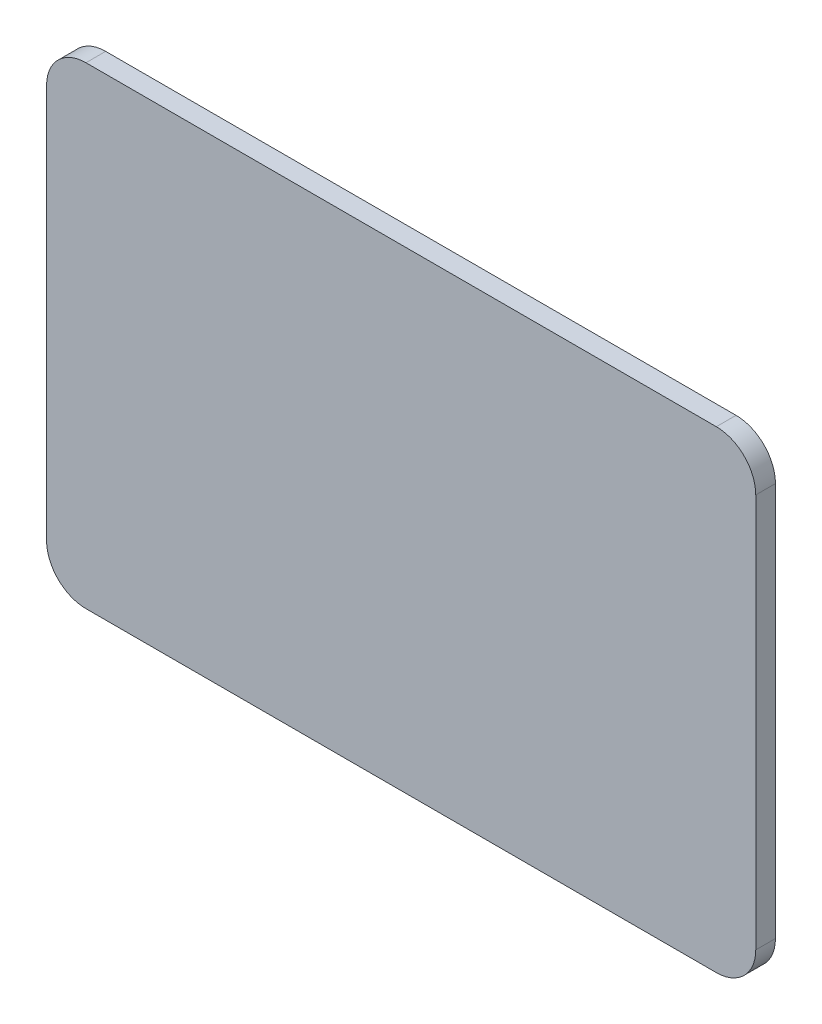
ISO-10303-21;
HEADER;
FILE_DESCRIPTION(('STEP AP214'),'2;1');
FILE_NAME('part.step','',(''),(''),'','','');
FILE_SCHEMA(('AUTOMOTIVE_DESIGN { 1 0 10303 214 1 1 1 1 }'));
ENDSEC;
DATA;
#1=APPLICATION_CONTEXT('core data for automotive mechanical design processes');
#2=APPLICATION_PROTOCOL_DEFINITION('international standard','automotive_design',2000,#1);
#3=PRODUCT_CONTEXT('',#1,'mechanical');
#4=PRODUCT('Part','Part','',(#3));
#5=PRODUCT_RELATED_PRODUCT_CATEGORY('part','',(#4));
#6=PRODUCT_DEFINITION_FORMATION('','',#4);
#7=PRODUCT_DEFINITION_CONTEXT('part definition',#1,'design');
#8=PRODUCT_DEFINITION('design','',#6,#7);
#9=PRODUCT_DEFINITION_SHAPE('','',#8);
#10=(LENGTH_UNIT() NAMED_UNIT(*) SI_UNIT(.MILLI.,.METRE.));
#11=(NAMED_UNIT(*) PLANE_ANGLE_UNIT() SI_UNIT($,.RADIAN.));
#12=(NAMED_UNIT(*) SI_UNIT($,.STERADIAN.) SOLID_ANGLE_UNIT());
#13=UNCERTAINTY_MEASURE_WITH_UNIT(LENGTH_MEASURE(1.E-05),#10,'distance_accuracy_value','');
#14=(GEOMETRIC_REPRESENTATION_CONTEXT(3) GLOBAL_UNCERTAINTY_ASSIGNED_CONTEXT((#13)) GLOBAL_UNIT_ASSIGNED_CONTEXT((#10,
#11,#12)) REPRESENTATION_CONTEXT('',''));
#15=CARTESIAN_POINT('',(0.,0.,0.));
#16=DIRECTION('',(0.,0.,1.));
#17=DIRECTION('',(1.,0.,0.));
#18=AXIS2_PLACEMENT_3D('',#15,#16,#17);
#19=CARTESIAN_POINT('',(57.15,38.1,3.175));
#20=DIRECTION('',(-1.,0.,0.));
#21=DIRECTION('',(0.,-1.,0.));
#22=AXIS2_PLACEMENT_3D('',#19,#20,#21);
#23=PLANE('',#22);
#24=DIRECTION('',(0.,1.,0.));
#25=VECTOR('',#24,1.);
#26=CARTESIAN_POINT('',(57.15,38.1,3.175));
#27=LINE('',#26,#25);
#28=CARTESIAN_POINT('',(57.15,-31.75,3.175));
#29=VERTEX_POINT('',#28);
#30=CARTESIAN_POINT('',(57.15,31.75,3.175));
#31=VERTEX_POINT('',#30);
#32=EDGE_CURVE('E124',#29,#31,#27,.T.);
#33=ORIENTED_EDGE('',*,*,#32,.F.);
#34=DIRECTION('',(0.,0.,-1.));
#35=VECTOR('',#34,1.);
#36=CARTESIAN_POINT('',(57.15,-31.75,3.175));
#37=LINE('',#36,#35);
#38=CARTESIAN_POINT('',(57.15,-31.75,0.));
#39=VERTEX_POINT('',#38);
#40=EDGE_CURVE('E109',#29,#39,#37,.T.);
#41=ORIENTED_EDGE('',*,*,#40,.T.);
#42=DIRECTION('',(0.,1.,0.));
#43=VECTOR('',#42,1.);
#44=CARTESIAN_POINT('',(57.15,38.1,0.));
#45=LINE('',#44,#43);
#46=CARTESIAN_POINT('',(57.15,31.75,0.));
#47=VERTEX_POINT('',#46);
#48=EDGE_CURVE('E121',#39,#47,#45,.T.);
#49=ORIENTED_EDGE('',*,*,#48,.T.);
#50=DIRECTION('',(0.,0.,-1.));
#51=VECTOR('',#50,1.);
#52=CARTESIAN_POINT('',(57.15,31.75,3.175));
#53=LINE('',#52,#51);
#54=EDGE_CURVE('E126',#47,#31,#53,.F.);
#55=ORIENTED_EDGE('',*,*,#54,.T.);
#56=EDGE_LOOP('',(#33,#41,#49,#55));
#57=FACE_BOUND('',#56,.T.);
#58=ADVANCED_FACE('F39',(#57),#23,.F.);
#59=CARTESIAN_POINT('',(-57.15,38.1,3.175));
#60=DIRECTION('',(0.,-1.,0.));
#61=DIRECTION('',(0.,0.,-1.));
#62=AXIS2_PLACEMENT_3D('',#59,#60,#61);
#63=PLANE('',#62);
#64=DIRECTION('',(-1.,0.,0.));
#65=VECTOR('',#64,1.);
#66=CARTESIAN_POINT('',(-57.15,38.1,3.175));
#67=LINE('',#66,#65);
#68=CARTESIAN_POINT('',(50.8,38.1,3.175));
#69=VERTEX_POINT('',#68);
#70=CARTESIAN_POINT('',(-50.8,38.1,3.175));
#71=VERTEX_POINT('',#70);
#72=EDGE_CURVE('E164',#69,#71,#67,.T.);
#73=ORIENTED_EDGE('',*,*,#72,.F.);
#74=DIRECTION('',(0.,0.,-1.));
#75=VECTOR('',#74,1.);
#76=CARTESIAN_POINT('',(50.8,38.1,3.175));
#77=LINE('',#76,#75);
#78=CARTESIAN_POINT('',(50.8,38.1,0.));
#79=VERTEX_POINT('',#78);
#80=EDGE_CURVE('E176',#69,#79,#77,.T.);
#81=ORIENTED_EDGE('',*,*,#80,.T.);
#82=DIRECTION('',(-1.,0.,0.));
#83=VECTOR('',#82,1.);
#84=CARTESIAN_POINT('',(-57.15,38.1,0.));
#85=LINE('',#84,#83);
#86=CARTESIAN_POINT('',(-50.8,38.1,0.));
#87=VERTEX_POINT('',#86);
#88=EDGE_CURVE('E130',#79,#87,#85,.T.);
#89=ORIENTED_EDGE('',*,*,#88,.T.);
#90=DIRECTION('',(0.,0.,-1.));
#91=VECTOR('',#90,1.);
#92=CARTESIAN_POINT('',(-50.8,38.1,3.175));
#93=LINE('',#92,#91);
#94=EDGE_CURVE('E174',#87,#71,#93,.F.);
#95=ORIENTED_EDGE('',*,*,#94,.T.);
#96=EDGE_LOOP('',(#73,#81,#89,#95));
#97=FACE_BOUND('',#96,.T.);
#98=ADVANCED_FACE('F181',(#97),#63,.F.);
#99=CARTESIAN_POINT('',(-57.15,38.1,3.175));
#100=DIRECTION('',(1.,0.,0.));
#101=DIRECTION('',(0.,1.,0.));
#102=AXIS2_PLACEMENT_3D('',#99,#100,#101);
#103=PLANE('',#102);
#104=DIRECTION('',(0.,-1.,0.));
#105=VECTOR('',#104,1.);
#106=CARTESIAN_POINT('',(-57.15,38.1,3.175));
#107=LINE('',#106,#105);
#108=CARTESIAN_POINT('',(-57.15,31.75,3.175));
#109=VERTEX_POINT('',#108);
#110=CARTESIAN_POINT('',(-57.15,-31.75,3.175));
#111=VERTEX_POINT('',#110);
#112=EDGE_CURVE('E162',#109,#111,#107,.T.);
#113=ORIENTED_EDGE('',*,*,#112,.F.);
#114=DIRECTION('',(0.,0.,-1.));
#115=VECTOR('',#114,1.);
#116=CARTESIAN_POINT('',(-57.15,31.75,3.175));
#117=LINE('',#116,#115);
#118=CARTESIAN_POINT('',(-57.15,31.75,0.));
#119=VERTEX_POINT('',#118);
#120=EDGE_CURVE('E12',#109,#119,#117,.T.);
#121=ORIENTED_EDGE('',*,*,#120,.T.);
#122=DIRECTION('',(0.,-1.,0.));
#123=VECTOR('',#122,1.);
#124=CARTESIAN_POINT('',(-57.15,38.1,0.));
#125=LINE('',#124,#123);
#126=CARTESIAN_POINT('',(-57.15,-31.75,0.));
#127=VERTEX_POINT('',#126);
#128=EDGE_CURVE('E133',#119,#127,#125,.T.);
#129=ORIENTED_EDGE('',*,*,#128,.T.);
#130=DIRECTION('',(0.,0.,-1.));
#131=VECTOR('',#130,1.);
#132=CARTESIAN_POINT('',(-57.15,-31.75,3.175));
#133=LINE('',#132,#131);
#134=EDGE_CURVE('E47',#127,#111,#133,.F.);
#135=ORIENTED_EDGE('',*,*,#134,.T.);
#136=EDGE_LOOP('',(#113,#121,#129,#135));
#137=FACE_BOUND('',#136,.T.);
#138=ADVANCED_FACE('F189',(#137),#103,.F.);
#139=CARTESIAN_POINT('',(-57.15,-38.1,3.175));
#140=DIRECTION('',(0.,1.,0.));
#141=DIRECTION('',(0.,0.,1.));
#142=AXIS2_PLACEMENT_3D('',#139,#140,#141);
#143=PLANE('',#142);
#144=DIRECTION('',(1.,0.,0.));
#145=VECTOR('',#144,1.);
#146=CARTESIAN_POINT('',(-57.15,-38.1,0.));
#147=LINE('',#146,#145);
#148=CARTESIAN_POINT('',(-50.8,-38.1,0.));
#149=VERTEX_POINT('',#148);
#150=CARTESIAN_POINT('',(50.8,-38.1,0.));
#151=VERTEX_POINT('',#150);
#152=EDGE_CURVE('E141',#149,#151,#147,.T.);
#153=ORIENTED_EDGE('',*,*,#152,.T.);
#154=DIRECTION('',(0.,0.,-1.));
#155=VECTOR('',#154,1.);
#156=CARTESIAN_POINT('',(50.8,-38.1,3.175));
#157=LINE('',#156,#155);
#158=CARTESIAN_POINT('',(50.8,-38.1,3.175));
#159=VERTEX_POINT('',#158);
#160=EDGE_CURVE('E110',#151,#159,#157,.F.);
#161=ORIENTED_EDGE('',*,*,#160,.T.);
#162=DIRECTION('',(1.,0.,0.));
#163=VECTOR('',#162,1.);
#164=CARTESIAN_POINT('',(-57.15,-38.1,3.175));
#165=LINE('',#164,#163);
#166=CARTESIAN_POINT('',(-50.8,-38.1,3.175));
#167=VERTEX_POINT('',#166);
#168=EDGE_CURVE('E136',#167,#159,#165,.T.);
#169=ORIENTED_EDGE('',*,*,#168,.F.);
#170=DIRECTION('',(0.,0.,-1.));
#171=VECTOR('',#170,1.);
#172=CARTESIAN_POINT('',(-50.8,-38.1,3.175));
#173=LINE('',#172,#171);
#174=EDGE_CURVE('E115',#167,#149,#173,.T.);
#175=ORIENTED_EDGE('',*,*,#174,.T.);
#176=EDGE_LOOP('',(#153,#161,#169,#175));
#177=FACE_BOUND('',#176,.T.);
#178=ADVANCED_FACE('F197',(#177),#143,.F.);
#179=CARTESIAN_POINT('',(0.,0.,3.175));
#180=DIRECTION('',(0.,0.,1.));
#181=DIRECTION('',(1.,0.,0.));
#182=AXIS2_PLACEMENT_3D('',#179,#180,#181);
#183=PLANE('',#182);
#184=ORIENTED_EDGE('',*,*,#168,.T.);
#185=CARTESIAN_POINT('',(50.8,-31.75,3.175));
#186=DIRECTION('',(0.,0.,1.));
#187=DIRECTION('',(1.,0.,0.));
#188=AXIS2_PLACEMENT_3D('',#185,#186,#187);
#189=CIRCLE('',#188,6.35);
#190=EDGE_CURVE('E171',#159,#29,#189,.T.);
#191=ORIENTED_EDGE('',*,*,#190,.T.);
#192=ORIENTED_EDGE('',*,*,#32,.T.);
#193=CARTESIAN_POINT('',(50.8,31.75,3.175));
#194=DIRECTION('',(0.,0.,1.));
#195=DIRECTION('',(1.,0.,0.));
#196=AXIS2_PLACEMENT_3D('',#193,#194,#195);
#197=CIRCLE('',#196,6.35);
#198=EDGE_CURVE('E155',#31,#69,#197,.T.);
#199=ORIENTED_EDGE('',*,*,#198,.T.);
#200=ORIENTED_EDGE('',*,*,#72,.T.);
#201=CARTESIAN_POINT('',(-50.8,31.75,3.175));
#202=DIRECTION('',(0.,0.,1.));
#203=DIRECTION('',(1.,0.,0.));
#204=AXIS2_PLACEMENT_3D('',#201,#202,#203);
#205=CIRCLE('',#204,6.35);
#206=EDGE_CURVE('E60',#71,#109,#205,.T.);
#207=ORIENTED_EDGE('',*,*,#206,.T.);
#208=ORIENTED_EDGE('',*,*,#112,.T.);
#209=CARTESIAN_POINT('',(-50.8,-31.75,3.175));
#210=DIRECTION('',(0.,0.,1.));
#211=DIRECTION('',(1.,0.,0.));
#212=AXIS2_PLACEMENT_3D('',#209,#210,#211);
#213=CIRCLE('',#212,6.35);
#214=EDGE_CURVE('E150',#111,#167,#213,.T.);
#215=ORIENTED_EDGE('',*,*,#214,.T.);
#216=EDGE_LOOP('',(#184,#191,#192,#199,#200,#207,#208,#215));
#217=FACE_BOUND('',#216,.T.);
#218=ADVANCED_FACE('F192',(#217),#183,.T.);
#219=CARTESIAN_POINT('',(0.,0.,0.));
#220=DIRECTION('',(0.,0.,1.));
#221=DIRECTION('',(1.,0.,0.));
#222=AXIS2_PLACEMENT_3D('',#219,#220,#221);
#223=PLANE('',#222);
#224=ORIENTED_EDGE('',*,*,#48,.F.);
#225=CARTESIAN_POINT('',(50.8,-31.75,0.));
#226=DIRECTION('',(0.,0.,1.));
#227=DIRECTION('',(1.,0.,0.));
#228=AXIS2_PLACEMENT_3D('',#225,#226,#227);
#229=CIRCLE('',#228,6.35);
#230=EDGE_CURVE('E105',#39,#151,#229,.F.);
#231=ORIENTED_EDGE('',*,*,#230,.T.);
#232=ORIENTED_EDGE('',*,*,#152,.F.);
#233=CARTESIAN_POINT('',(-50.8,-31.75,0.));
#234=DIRECTION('',(0.,0.,1.));
#235=DIRECTION('',(1.,0.,0.));
#236=AXIS2_PLACEMENT_3D('',#233,#234,#235);
#237=CIRCLE('',#236,6.35);
#238=EDGE_CURVE('E125',#149,#127,#237,.F.);
#239=ORIENTED_EDGE('',*,*,#238,.T.);
#240=ORIENTED_EDGE('',*,*,#128,.F.);
#241=CARTESIAN_POINT('',(-50.8,31.75,0.));
#242=DIRECTION('',(0.,0.,1.));
#243=DIRECTION('',(1.,0.,0.));
#244=AXIS2_PLACEMENT_3D('',#241,#242,#243);
#245=CIRCLE('',#244,6.35);
#246=EDGE_CURVE('E145',#119,#87,#245,.F.);
#247=ORIENTED_EDGE('',*,*,#246,.T.);
#248=ORIENTED_EDGE('',*,*,#88,.F.);
#249=CARTESIAN_POINT('',(50.8,31.75,0.));
#250=DIRECTION('',(0.,0.,1.));
#251=DIRECTION('',(1.,0.,0.));
#252=AXIS2_PLACEMENT_3D('',#249,#250,#251);
#253=CIRCLE('',#252,6.35);
#254=EDGE_CURVE('E116',#79,#47,#253,.F.);
#255=ORIENTED_EDGE('',*,*,#254,.T.);
#256=EDGE_LOOP('',(#224,#231,#232,#239,#240,#247,#248,#255));
#257=FACE_BOUND('',#256,.T.);
#258=ADVANCED_FACE('F128',(#257),#223,.F.);
#259=CARTESIAN_POINT('',(50.8,-31.75,3.175));
#260=DIRECTION('',(0.,0.,-1.));
#261=DIRECTION('',(-1.,0.,0.));
#262=AXIS2_PLACEMENT_3D('',#259,#260,#261);
#263=CYLINDRICAL_SURFACE('',#262,6.35);
#264=ORIENTED_EDGE('',*,*,#190,.F.);
#265=ORIENTED_EDGE('',*,*,#160,.F.);
#266=ORIENTED_EDGE('',*,*,#230,.F.);
#267=ORIENTED_EDGE('',*,*,#40,.F.);
#268=EDGE_LOOP('',(#264,#265,#266,#267));
#269=FACE_BOUND('',#268,.T.);
#270=ADVANCED_FACE('F108',(#269),#263,.T.);
#271=CARTESIAN_POINT('',(50.8,31.75,3.175));
#272=DIRECTION('',(0.,0.,-1.));
#273=DIRECTION('',(-1.,0.,0.));
#274=AXIS2_PLACEMENT_3D('',#271,#272,#273);
#275=CYLINDRICAL_SURFACE('',#274,6.35);
#276=ORIENTED_EDGE('',*,*,#198,.F.);
#277=ORIENTED_EDGE('',*,*,#54,.F.);
#278=ORIENTED_EDGE('',*,*,#254,.F.);
#279=ORIENTED_EDGE('',*,*,#80,.F.);
#280=EDGE_LOOP('',(#276,#277,#278,#279));
#281=FACE_BOUND('',#280,.T.);
#282=ADVANCED_FACE('F198',(#281),#275,.T.);
#283=CARTESIAN_POINT('',(-50.8,31.75,3.175));
#284=DIRECTION('',(0.,0.,-1.));
#285=DIRECTION('',(-1.,0.,0.));
#286=AXIS2_PLACEMENT_3D('',#283,#284,#285);
#287=CYLINDRICAL_SURFACE('',#286,6.35);
#288=ORIENTED_EDGE('',*,*,#206,.F.);
#289=ORIENTED_EDGE('',*,*,#94,.F.);
#290=ORIENTED_EDGE('',*,*,#246,.F.);
#291=ORIENTED_EDGE('',*,*,#120,.F.);
#292=EDGE_LOOP('',(#288,#289,#290,#291));
#293=FACE_BOUND('',#292,.T.);
#294=ADVANCED_FACE('F188',(#293),#287,.T.);
#295=CARTESIAN_POINT('',(-50.8,-31.75,3.175));
#296=DIRECTION('',(0.,0.,-1.));
#297=DIRECTION('',(-1.,0.,0.));
#298=AXIS2_PLACEMENT_3D('',#295,#296,#297);
#299=CYLINDRICAL_SURFACE('',#298,6.35);
#300=ORIENTED_EDGE('',*,*,#214,.F.);
#301=ORIENTED_EDGE('',*,*,#134,.F.);
#302=ORIENTED_EDGE('',*,*,#238,.F.);
#303=ORIENTED_EDGE('',*,*,#174,.F.);
#304=EDGE_LOOP('',(#300,#301,#302,#303));
#305=FACE_BOUND('',#304,.T.);
#306=ADVANCED_FACE('F41',(#305),#299,.T.);
#307=CLOSED_SHELL('',(#58,#98,#138,#178,#218,#258,#270,#282,#294,#306));
#308=MANIFOLD_SOLID_BREP('B2',#307);
#309=ADVANCED_BREP_SHAPE_REPRESENTATION('',(#18,#308),#14);
#310=SHAPE_DEFINITION_REPRESENTATION(#9,#309);
ENDSEC;
END-ISO-10303-21;
